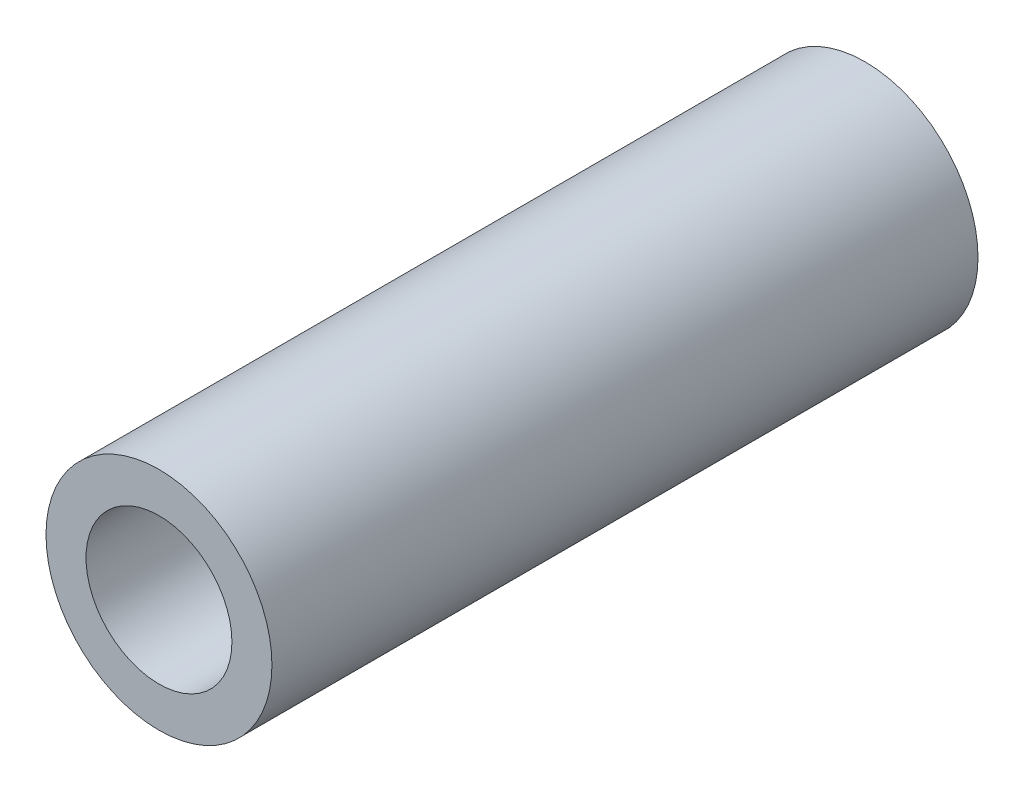
ISO-10303-21;
HEADER;
FILE_DESCRIPTION(('STEP AP214'),'2;1');
FILE_NAME('part.step','',(''),(''),'','','');
FILE_SCHEMA(('AUTOMOTIVE_DESIGN { 1 0 10303 214 1 1 1 1 }'));
ENDSEC;
DATA;
#1=APPLICATION_CONTEXT('core data for automotive mechanical design processes');
#2=APPLICATION_PROTOCOL_DEFINITION('international standard','automotive_design',2000,#1);
#3=PRODUCT_CONTEXT('',#1,'mechanical');
#4=PRODUCT('Part','Part','',(#3));
#5=PRODUCT_RELATED_PRODUCT_CATEGORY('part','',(#4));
#6=PRODUCT_DEFINITION_FORMATION('','',#4);
#7=PRODUCT_DEFINITION_CONTEXT('part definition',#1,'design');
#8=PRODUCT_DEFINITION('design','',#6,#7);
#9=PRODUCT_DEFINITION_SHAPE('','',#8);
#10=(LENGTH_UNIT() NAMED_UNIT(*) SI_UNIT(.MILLI.,.METRE.));
#11=(NAMED_UNIT(*) PLANE_ANGLE_UNIT() SI_UNIT($,.RADIAN.));
#12=(NAMED_UNIT(*) SI_UNIT($,.STERADIAN.) SOLID_ANGLE_UNIT());
#13=UNCERTAINTY_MEASURE_WITH_UNIT(LENGTH_MEASURE(1.E-05),#10,'distance_accuracy_value','');
#14=(GEOMETRIC_REPRESENTATION_CONTEXT(3) GLOBAL_UNCERTAINTY_ASSIGNED_CONTEXT((#13)) GLOBAL_UNIT_ASSIGNED_CONTEXT((#10,
#11,#12)) REPRESENTATION_CONTEXT('',''));
#15=CARTESIAN_POINT('',(0.,0.,0.));
#16=DIRECTION('',(0.,0.,1.));
#17=DIRECTION('',(1.,0.,0.));
#18=AXIS2_PLACEMENT_3D('',#15,#16,#17);
#19=CARTESIAN_POINT('',(-33.8929901882352,10.6703116736639,15.));
#20=DIRECTION('',(0.,0.,1.));
#21=DIRECTION('',(1.,0.,0.));
#22=AXIS2_PLACEMENT_3D('',#19,#20,#21);
#23=PLANE('',#22);
#24=CARTESIAN_POINT('',(-33.8929901882352,10.6703116736639,15.));
#25=DIRECTION('',(0.,0.,1.));
#26=DIRECTION('',(1.,0.,0.));
#27=AXIS2_PLACEMENT_3D('',#24,#25,#26);
#28=CIRCLE('',#27,2.4);
#29=CARTESIAN_POINT('',(-31.4929901882352,10.6703116736639,15.));
#30=VERTEX_POINT('',#29);
#31=EDGE_CURVE('E10',#30,#30,#28,.T.);
#32=ORIENTED_EDGE('',*,*,#31,.T.);
#33=EDGE_LOOP('',(#32));
#34=FACE_BOUND('',#33,.T.);
#35=CARTESIAN_POINT('',(-33.8929901882352,10.6703116736639,15.));
#36=DIRECTION('',(0.,0.,1.));
#37=DIRECTION('',(1.,0.,0.));
#38=AXIS2_PLACEMENT_3D('',#35,#36,#37);
#39=CIRCLE('',#38,1.55);
#40=CARTESIAN_POINT('',(-32.3429901882352,10.6703116736639,15.));
#41=VERTEX_POINT('',#40);
#42=EDGE_CURVE('E42',#41,#41,#39,.T.);
#43=ORIENTED_EDGE('',*,*,#42,.F.);
#44=EDGE_LOOP('',(#43));
#45=FACE_BOUND('',#44,.T.);
#46=ADVANCED_FACE('F31',(#34,#45),#23,.T.);
#47=CARTESIAN_POINT('',(-33.8929901882352,10.6703116736639,0.));
#48=DIRECTION('',(0.,0.,1.));
#49=DIRECTION('',(1.,0.,0.));
#50=AXIS2_PLACEMENT_3D('',#47,#48,#49);
#51=PLANE('',#50);
#52=CARTESIAN_POINT('',(-33.8929901882352,10.6703116736639,0.));
#53=DIRECTION('',(0.,0.,1.));
#54=DIRECTION('',(1.,0.,0.));
#55=AXIS2_PLACEMENT_3D('',#52,#53,#54);
#56=CIRCLE('',#55,2.4);
#57=CARTESIAN_POINT('',(-31.4929901882352,10.6703116736639,0.));
#58=VERTEX_POINT('',#57);
#59=EDGE_CURVE('E35',#58,#58,#56,.T.);
#60=ORIENTED_EDGE('',*,*,#59,.F.);
#61=EDGE_LOOP('',(#60));
#62=FACE_BOUND('',#61,.T.);
#63=CARTESIAN_POINT('',(-33.8929901882352,10.6703116736639,0.));
#64=DIRECTION('',(0.,0.,1.));
#65=DIRECTION('',(1.,0.,0.));
#66=AXIS2_PLACEMENT_3D('',#63,#64,#65);
#67=CIRCLE('',#66,1.55);
#68=CARTESIAN_POINT('',(-32.3429901882352,10.6703116736639,0.));
#69=VERTEX_POINT('',#68);
#70=EDGE_CURVE('E44',#69,#69,#67,.T.);
#71=ORIENTED_EDGE('',*,*,#70,.T.);
#72=EDGE_LOOP('',(#71));
#73=FACE_BOUND('',#72,.T.);
#74=ADVANCED_FACE('F54',(#62,#73),#51,.F.);
#75=CARTESIAN_POINT('',(-33.8929901882352,10.6703116736639,15.));
#76=DIRECTION('',(0.,0.,-1.));
#77=DIRECTION('',(-1.,0.,0.));
#78=AXIS2_PLACEMENT_3D('',#75,#76,#77);
#79=CYLINDRICAL_SURFACE('',#78,2.4);
#80=ORIENTED_EDGE('',*,*,#31,.F.);
#81=EDGE_LOOP('',(#80));
#82=FACE_BOUND('',#81,.T.);
#83=ORIENTED_EDGE('',*,*,#59,.T.);
#84=EDGE_LOOP('',(#83));
#85=FACE_BOUND('',#84,.T.);
#86=ADVANCED_FACE('F33',(#82,#85),#79,.T.);
#87=CARTESIAN_POINT('',(-33.8929901882352,10.6703116736639,15.));
#88=DIRECTION('',(0.,0.,-1.));
#89=DIRECTION('',(-1.,0.,0.));
#90=AXIS2_PLACEMENT_3D('',#87,#88,#89);
#91=CYLINDRICAL_SURFACE('',#90,1.55);
#92=ORIENTED_EDGE('',*,*,#42,.T.);
#93=EDGE_LOOP('',(#92));
#94=FACE_BOUND('',#93,.T.);
#95=ORIENTED_EDGE('',*,*,#70,.F.);
#96=EDGE_LOOP('',(#95));
#97=FACE_BOUND('',#96,.T.);
#98=ADVANCED_FACE('F50',(#94,#97),#91,.F.);
#99=CLOSED_SHELL('',(#46,#74,#86,#98));
#100=MANIFOLD_SOLID_BREP('B2',#99);
#101=ADVANCED_BREP_SHAPE_REPRESENTATION('',(#18,#100),#14);
#102=SHAPE_DEFINITION_REPRESENTATION(#9,#101);
ENDSEC;
END-ISO-10303-21;
